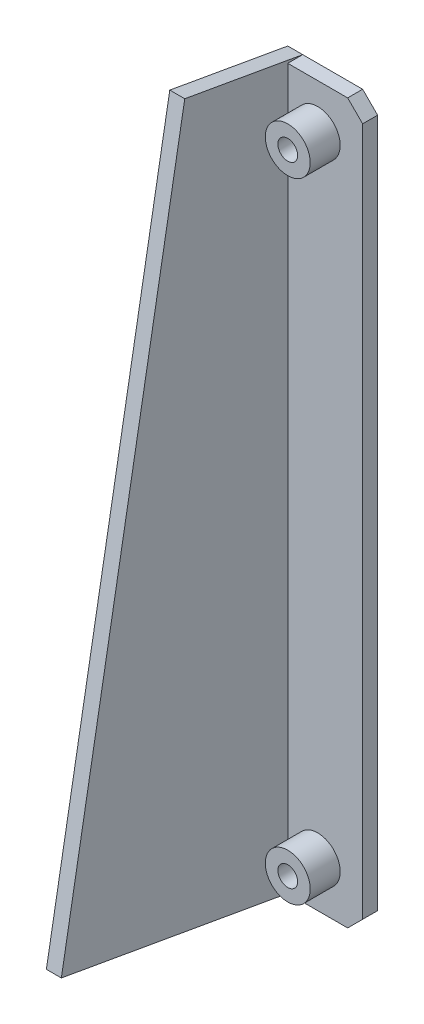
ISO-10303-21;
HEADER;
FILE_DESCRIPTION(('STEP AP214'),'2;1');
FILE_NAME('part.step','',(''),(''),'','','');
FILE_SCHEMA(('AUTOMOTIVE_DESIGN { 1 0 10303 214 1 1 1 1 }'));
ENDSEC;
DATA;
#1=APPLICATION_CONTEXT('core data for automotive mechanical design processes');
#2=APPLICATION_PROTOCOL_DEFINITION('international standard','automotive_design',2000,#1);
#3=PRODUCT_CONTEXT('',#1,'mechanical');
#4=PRODUCT('Part','Part','',(#3));
#5=PRODUCT_RELATED_PRODUCT_CATEGORY('part','',(#4));
#6=PRODUCT_DEFINITION_FORMATION('','',#4);
#7=PRODUCT_DEFINITION_CONTEXT('part definition',#1,'design');
#8=PRODUCT_DEFINITION('design','',#6,#7);
#9=PRODUCT_DEFINITION_SHAPE('','',#8);
#10=(LENGTH_UNIT() NAMED_UNIT(*) SI_UNIT(.MILLI.,.METRE.));
#11=(NAMED_UNIT(*) PLANE_ANGLE_UNIT() SI_UNIT($,.RADIAN.));
#12=(NAMED_UNIT(*) SI_UNIT($,.STERADIAN.) SOLID_ANGLE_UNIT());
#13=UNCERTAINTY_MEASURE_WITH_UNIT(LENGTH_MEASURE(1.E-05),#10,'distance_accuracy_value','');
#14=(GEOMETRIC_REPRESENTATION_CONTEXT(3) GLOBAL_UNCERTAINTY_ASSIGNED_CONTEXT((#13)) GLOBAL_UNIT_ASSIGNED_CONTEXT((#10,
#11,#12)) REPRESENTATION_CONTEXT('',''));
#15=CARTESIAN_POINT('',(0.,0.,0.));
#16=DIRECTION('',(0.,0.,1.));
#17=DIRECTION('',(1.,0.,0.));
#18=AXIS2_PLACEMENT_3D('',#15,#16,#17);
#19=CARTESIAN_POINT('',(0.,0.,1.5875));
#20=DIRECTION('',(0.,0.,1.));
#21=DIRECTION('',(1.,0.,0.));
#22=AXIS2_PLACEMENT_3D('',#19,#20,#21);
#23=PLANE('',#22);
#24=DIRECTION('',(0.,1.,0.));
#25=VECTOR('',#24,1.);
#26=CARTESIAN_POINT('',(-7.93749999999984,0.,1.5875));
#27=LINE('',#26,#25);
#28=CARTESIAN_POINT('',(-7.93749999999984,0.,1.58750000000002));
#29=VERTEX_POINT('',#28);
#30=CARTESIAN_POINT('',(-7.93749999999999,76.2,1.5875));
#31=VERTEX_POINT('',#30);
#32=EDGE_CURVE('E194',#29,#31,#27,.T.);
#33=ORIENTED_EDGE('',*,*,#32,.F.);
#34=DIRECTION('',(1.,0.,0.));
#35=VECTOR('',#34,1.);
#36=CARTESIAN_POINT('',(0.,0.,1.5875));
#37=LINE('',#36,#35);
#38=CARTESIAN_POINT('',(-1.58750000000001,0.,1.5875));
#39=VERTEX_POINT('',#38);
#40=EDGE_CURVE('E140',#29,#39,#37,.T.);
#41=ORIENTED_EDGE('',*,*,#40,.T.);
#42=DIRECTION('',(-0.707106781186551,-0.707106781186544,0.));
#43=VECTOR('',#42,1.);
#44=CARTESIAN_POINT('',(-0.793749999999999,0.793750000000006,1.5875));
#45=LINE('',#44,#43);
#46=CARTESIAN_POINT('',(0.,1.5875,1.5875));
#47=VERTEX_POINT('',#46);
#48=EDGE_CURVE('E150',#39,#47,#45,.F.);
#49=ORIENTED_EDGE('',*,*,#48,.T.);
#50=DIRECTION('',(0.,1.,0.));
#51=VECTOR('',#50,1.);
#52=CARTESIAN_POINT('',(0.,0.,1.5875));
#53=LINE('',#52,#51);
#54=CARTESIAN_POINT('',(0.,74.6125,1.5875));
#55=VERTEX_POINT('',#54);
#56=EDGE_CURVE('E116',#47,#55,#53,.T.);
#57=ORIENTED_EDGE('',*,*,#56,.T.);
#58=DIRECTION('',(0.707106781186548,-0.707106781186548,0.));
#59=VECTOR('',#58,1.);
#60=CARTESIAN_POINT('',(37.30625,37.30625,1.5875));
#61=LINE('',#60,#59);
#62=CARTESIAN_POINT('',(-1.5875,76.2,1.5875));
#63=VERTEX_POINT('',#62);
#64=EDGE_CURVE('E44',#55,#63,#61,.F.);
#65=ORIENTED_EDGE('',*,*,#64,.T.);
#66=DIRECTION('',(-1.,0.,0.));
#67=VECTOR('',#66,1.);
#68=CARTESIAN_POINT('',(0.,76.2,1.5875));
#69=LINE('',#68,#67);
#70=EDGE_CURVE('E157',#63,#31,#69,.T.);
#71=ORIENTED_EDGE('',*,*,#70,.T.);
#72=EDGE_LOOP('',(#33,#41,#49,#57,#65,#71));
#73=FACE_BOUND('',#72,.T.);
#74=CARTESIAN_POINT('',(-4.7625,4.7625,1.5875));
#75=DIRECTION('',(0.,0.,1.));
#76=DIRECTION('',(1.,0.,0.));
#77=AXIS2_PLACEMENT_3D('',#74,#75,#76);
#78=CIRCLE('',#77,2.38125);
#79=CARTESIAN_POINT('',(-2.38125,4.7625,1.5875));
#80=VERTEX_POINT('',#79);
#81=EDGE_CURVE('E177',#80,#80,#78,.T.);
#82=ORIENTED_EDGE('',*,*,#81,.F.);
#83=EDGE_LOOP('',(#82));
#84=FACE_BOUND('',#83,.T.);
#85=CARTESIAN_POINT('',(-4.7625,71.4375,1.5875));
#86=DIRECTION('',(0.,0.,1.));
#87=DIRECTION('',(-1.,0.,0.));
#88=AXIS2_PLACEMENT_3D('',#85,#86,#87);
#89=CIRCLE('',#88,2.38125);
#90=CARTESIAN_POINT('',(-7.14375,71.4375,1.5875));
#91=VERTEX_POINT('',#90);
#92=EDGE_CURVE('E186',#91,#91,#89,.T.);
#93=ORIENTED_EDGE('',*,*,#92,.F.);
#94=EDGE_LOOP('',(#93));
#95=FACE_BOUND('',#94,.T.);
#96=ADVANCED_FACE('F35',(#73,#84,#95),#23,.T.);
#97=CARTESIAN_POINT('',(0.,0.,1.5875));
#98=DIRECTION('',(-1.,0.,0.));
#99=DIRECTION('',(0.,0.,1.));
#100=AXIS2_PLACEMENT_3D('',#97,#98,#99);
#101=PLANE('',#100);
#102=DIRECTION('',(0.,1.,0.));
#103=VECTOR('',#102,1.);
#104=CARTESIAN_POINT('',(0.,0.,0.));
#105=LINE('',#104,#103);
#106=CARTESIAN_POINT('',(0.,1.5875,0.));
#107=VERTEX_POINT('',#106);
#108=CARTESIAN_POINT('',(0.,74.6125,0.));
#109=VERTEX_POINT('',#108);
#110=EDGE_CURVE('E132',#107,#109,#105,.T.);
#111=ORIENTED_EDGE('',*,*,#110,.T.);
#112=DIRECTION('',(0.,0.,1.));
#113=VECTOR('',#112,1.);
#114=CARTESIAN_POINT('',(0.,74.6125,1.5875));
#115=LINE('',#114,#113);
#116=EDGE_CURVE('E57',#109,#55,#115,.T.);
#117=ORIENTED_EDGE('',*,*,#116,.T.);
#118=ORIENTED_EDGE('',*,*,#56,.F.);
#119=DIRECTION('',(0.,0.,-1.));
#120=VECTOR('',#119,1.);
#121=CARTESIAN_POINT('',(0.,1.5875,1.5875));
#122=LINE('',#121,#120);
#123=EDGE_CURVE('E146',#47,#107,#122,.T.);
#124=ORIENTED_EDGE('',*,*,#123,.T.);
#125=EDGE_LOOP('',(#111,#117,#118,#124));
#126=FACE_BOUND('',#125,.T.);
#127=ADVANCED_FACE('F165',(#126),#101,.F.);
#128=CARTESIAN_POINT('',(0.,76.2,1.5875));
#129=DIRECTION('',(0.,-1.,0.));
#130=DIRECTION('',(1.,0.,0.));
#131=AXIS2_PLACEMENT_3D('',#128,#129,#130);
#132=PLANE('',#131);
#133=ORIENTED_EDGE('',*,*,#70,.F.);
#134=DIRECTION('',(0.,0.,-1.));
#135=VECTOR('',#134,1.);
#136=CARTESIAN_POINT('',(-1.5875,76.2,1.5875));
#137=LINE('',#136,#135);
#138=CARTESIAN_POINT('',(-1.5875,76.2,0.));
#139=VERTEX_POINT('',#138);
#140=EDGE_CURVE('E139',#63,#139,#137,.T.);
#141=ORIENTED_EDGE('',*,*,#140,.T.);
#142=DIRECTION('',(-1.,0.,0.));
#143=VECTOR('',#142,1.);
#144=CARTESIAN_POINT('',(0.,76.2,0.));
#145=LINE('',#144,#143);
#146=CARTESIAN_POINT('',(-7.93749999999984,76.2,0.));
#147=VERTEX_POINT('',#146);
#148=EDGE_CURVE('E129',#139,#147,#145,.T.);
#149=ORIENTED_EDGE('',*,*,#148,.T.);
#150=DIRECTION('',(0.,0.,1.));
#151=VECTOR('',#150,1.);
#152=CARTESIAN_POINT('',(-7.93749999999999,76.2,1.5875));
#153=LINE('',#152,#151);
#154=EDGE_CURVE('E136',#147,#31,#153,.T.);
#155=ORIENTED_EDGE('',*,*,#154,.T.);
#156=EDGE_LOOP('',(#133,#141,#149,#155));
#157=FACE_BOUND('',#156,.T.);
#158=ADVANCED_FACE('F161',(#157),#132,.F.);
#159=CARTESIAN_POINT('',(-9.52500000000001,0.,1.5875));
#160=DIRECTION('',(1.,0.,0.));
#161=DIRECTION('',(0.,1.,0.));
#162=AXIS2_PLACEMENT_3D('',#159,#160,#161);
#163=PLANE('',#162);
#164=DIRECTION('',(0.,-1.,0.));
#165=VECTOR('',#164,1.);
#166=CARTESIAN_POINT('',(-9.52500000000001,0.,0.));
#167=LINE('',#166,#165);
#168=CARTESIAN_POINT('',(-9.525,76.2,0.));
#169=VERTEX_POINT('',#168);
#170=CARTESIAN_POINT('',(-9.52500000000001,0.,0.));
#171=VERTEX_POINT('',#170);
#172=EDGE_CURVE('E112',#169,#171,#167,.T.);
#173=ORIENTED_EDGE('',*,*,#172,.T.);
#174=DIRECTION('',(0.,0.,1.));
#175=VECTOR('',#174,1.);
#176=CARTESIAN_POINT('',(-9.52500000000001,0.,0.));
#177=LINE('',#176,#175);
#178=CARTESIAN_POINT('',(-9.52500000000001,0.,1.58750000000002));
#179=VERTEX_POINT('',#178);
#180=EDGE_CURVE('E119',#171,#179,#177,.T.);
#181=ORIENTED_EDGE('',*,*,#180,.T.);
#182=DIRECTION('',(0.,-0.173648177666931,-0.984807753012208));
#183=VECTOR('',#182,1.);
#184=CARTESIAN_POINT('',(-9.52499999999985,4.23156451566216,25.5858949062142));
#185=LINE('',#184,#183);
#186=CARTESIAN_POINT('',(-9.52499999999985,4.23156451566216,25.5858949062142));
#187=VERTEX_POINT('',#186);
#188=EDGE_CURVE('E196',#187,#179,#185,.T.);
#189=ORIENTED_EDGE('',*,*,#188,.F.);
#190=DIRECTION('',(0.,0.984807753012208,-0.173648177666931));
#191=VECTOR('',#190,1.);
#192=CARTESIAN_POINT('',(-9.52500000000001,78.40533185637,12.507058463255));
#193=LINE('',#192,#191);
#194=CARTESIAN_POINT('',(-9.52500000000001,78.40533185637,12.507058463255));
#195=VERTEX_POINT('',#194);
#196=EDGE_CURVE('E208',#187,#195,#193,.T.);
#197=ORIENTED_EDGE('',*,*,#196,.T.);
#198=DIRECTION('',(0.,-0.173648177666931,-0.984807753012208));
#199=VECTOR('',#198,1.);
#200=CARTESIAN_POINT('',(-9.52500000000001,78.40533185637,12.507058463255));
#201=LINE('',#200,#199);
#202=EDGE_CURVE('E127',#195,#169,#201,.T.);
#203=ORIENTED_EDGE('',*,*,#202,.T.);
#204=EDGE_LOOP('',(#173,#181,#189,#197,#203));
#205=FACE_BOUND('',#204,.T.);
#206=ADVANCED_FACE('F125',(#205),#163,.F.);
#207=CARTESIAN_POINT('',(0.,0.,1.5875));
#208=DIRECTION('',(0.,1.,0.));
#209=DIRECTION('',(-1.,0.,0.));
#210=AXIS2_PLACEMENT_3D('',#207,#208,#209);
#211=PLANE('',#210);
#212=DIRECTION('',(1.,0.,0.));
#213=VECTOR('',#212,1.);
#214=CARTESIAN_POINT('',(0.,0.,0.));
#215=LINE('',#214,#213);
#216=CARTESIAN_POINT('',(-1.58750000000001,0.,0.));
#217=VERTEX_POINT('',#216);
#218=EDGE_CURVE('E107',#171,#217,#215,.T.);
#219=ORIENTED_EDGE('',*,*,#218,.T.);
#220=DIRECTION('',(0.,0.,1.));
#221=VECTOR('',#220,1.);
#222=CARTESIAN_POINT('',(-1.58750000000001,0.,1.5875));
#223=LINE('',#222,#221);
#224=EDGE_CURVE('E11',#217,#39,#223,.T.);
#225=ORIENTED_EDGE('',*,*,#224,.T.);
#226=ORIENTED_EDGE('',*,*,#40,.F.);
#227=DIRECTION('',(1.,0.,0.));
#228=VECTOR('',#227,1.);
#229=CARTESIAN_POINT('',(-9.52500000000001,0.,1.58750000000002));
#230=LINE('',#229,#228);
#231=EDGE_CURVE('E121',#179,#29,#230,.T.);
#232=ORIENTED_EDGE('',*,*,#231,.F.);
#233=ORIENTED_EDGE('',*,*,#180,.F.);
#234=EDGE_LOOP('',(#219,#225,#226,#232,#233));
#235=FACE_BOUND('',#234,.T.);
#236=ADVANCED_FACE('F120',(#235),#211,.F.);
#237=CARTESIAN_POINT('',(0.,0.,0.));
#238=DIRECTION('',(0.,0.,1.));
#239=DIRECTION('',(1.,0.,0.));
#240=AXIS2_PLACEMENT_3D('',#237,#238,#239);
#241=PLANE('',#240);
#242=CARTESIAN_POINT('',(-4.7625,4.7625,0.));
#243=DIRECTION('',(0.,0.,1.));
#244=DIRECTION('',(1.,0.,0.));
#245=AXIS2_PLACEMENT_3D('',#242,#243,#244);
#246=CIRCLE('',#245,1.04775);
#247=CARTESIAN_POINT('',(-3.71475,4.7625,0.));
#248=VERTEX_POINT('',#247);
#249=EDGE_CURVE('E169',#248,#248,#246,.T.);
#250=ORIENTED_EDGE('',*,*,#249,.T.);
#251=EDGE_LOOP('',(#250));
#252=FACE_BOUND('',#251,.T.);
#253=CARTESIAN_POINT('',(-4.7625,71.4375,0.));
#254=DIRECTION('',(0.,0.,1.));
#255=DIRECTION('',(1.,0.,0.));
#256=AXIS2_PLACEMENT_3D('',#253,#254,#255);
#257=CIRCLE('',#256,1.04775);
#258=CARTESIAN_POINT('',(-3.71475,71.4375,0.));
#259=VERTEX_POINT('',#258);
#260=EDGE_CURVE('E167',#259,#259,#257,.T.);
#261=ORIENTED_EDGE('',*,*,#260,.T.);
#262=EDGE_LOOP('',(#261));
#263=FACE_BOUND('',#262,.T.);
#264=ORIENTED_EDGE('',*,*,#218,.F.);
#265=ORIENTED_EDGE('',*,*,#172,.F.);
#266=DIRECTION('',(1.,0.,0.));
#267=VECTOR('',#266,1.);
#268=CARTESIAN_POINT('',(-9.525,76.2,0.));
#269=LINE('',#268,#267);
#270=EDGE_CURVE('E206',#169,#147,#269,.T.);
#271=ORIENTED_EDGE('',*,*,#270,.T.);
#272=ORIENTED_EDGE('',*,*,#148,.F.);
#273=DIRECTION('',(-0.707106781186548,0.707106781186548,0.));
#274=VECTOR('',#273,1.);
#275=CARTESIAN_POINT('',(-1.58750000000001,76.2,0.));
#276=LINE('',#275,#274);
#277=EDGE_CURVE('E144',#139,#109,#276,.F.);
#278=ORIENTED_EDGE('',*,*,#277,.T.);
#279=ORIENTED_EDGE('',*,*,#110,.F.);
#280=DIRECTION('',(0.707106781186551,0.707106781186544,0.));
#281=VECTOR('',#280,1.);
#282=CARTESIAN_POINT('',(0.,1.5875,0.));
#283=LINE('',#282,#281);
#284=EDGE_CURVE('E115',#107,#217,#283,.F.);
#285=ORIENTED_EDGE('',*,*,#284,.T.);
#286=EDGE_LOOP('',(#264,#265,#271,#272,#278,#279,#285));
#287=FACE_BOUND('',#286,.T.);
#288=ADVANCED_FACE('F109',(#252,#263,#287),#241,.F.);
#289=CARTESIAN_POINT('',(-1.58750000000001,76.2,1.5875));
#290=DIRECTION('',(-0.707106781186548,-0.707106781186548,0.));
#291=DIRECTION('',(0.,0.,-1.));
#292=AXIS2_PLACEMENT_3D('',#289,#290,#291);
#293=PLANE('',#292);
#294=ORIENTED_EDGE('',*,*,#64,.F.);
#295=ORIENTED_EDGE('',*,*,#116,.F.);
#296=ORIENTED_EDGE('',*,*,#277,.F.);
#297=ORIENTED_EDGE('',*,*,#140,.F.);
#298=EDGE_LOOP('',(#294,#295,#296,#297));
#299=FACE_BOUND('',#298,.T.);
#300=ADVANCED_FACE('F164',(#299),#293,.F.);
#301=CARTESIAN_POINT('',(0.,1.5875,1.5875));
#302=DIRECTION('',(-0.707106781186544,0.707106781186551,0.));
#303=DIRECTION('',(0.,0.,-1.));
#304=AXIS2_PLACEMENT_3D('',#301,#302,#303);
#305=PLANE('',#304);
#306=ORIENTED_EDGE('',*,*,#48,.F.);
#307=ORIENTED_EDGE('',*,*,#224,.F.);
#308=ORIENTED_EDGE('',*,*,#284,.F.);
#309=ORIENTED_EDGE('',*,*,#123,.F.);
#310=EDGE_LOOP('',(#306,#307,#308,#309));
#311=FACE_BOUND('',#310,.T.);
#312=ADVANCED_FACE('F38',(#311),#305,.F.);
#313=CARTESIAN_POINT('',(-4.7625,71.4375,1.5875));
#314=DIRECTION('',(0.,0.,1.));
#315=DIRECTION('',(1.,0.,0.));
#316=AXIS2_PLACEMENT_3D('',#313,#314,#315);
#317=CYLINDRICAL_SURFACE('',#316,1.04775);
#318=ORIENTED_EDGE('',*,*,#260,.F.);
#319=EDGE_LOOP('',(#318));
#320=FACE_BOUND('',#319,.T.);
#321=CARTESIAN_POINT('',(-4.7625,71.4375,4.7625));
#322=DIRECTION('',(0.,0.,1.));
#323=DIRECTION('',(-1.,0.,0.));
#324=AXIS2_PLACEMENT_3D('',#321,#322,#323);
#325=CIRCLE('',#324,1.04775);
#326=CARTESIAN_POINT('',(-5.81025,71.4375,4.7625));
#327=VERTEX_POINT('',#326);
#328=EDGE_CURVE('E189',#327,#327,#325,.T.);
#329=ORIENTED_EDGE('',*,*,#328,.T.);
#330=EDGE_LOOP('',(#329));
#331=FACE_BOUND('',#330,.T.);
#332=ADVANCED_FACE('F227',(#320,#331),#317,.F.);
#333=CARTESIAN_POINT('',(-4.7625,4.7625,1.5875));
#334=DIRECTION('',(0.,0.,1.));
#335=DIRECTION('',(1.,0.,0.));
#336=AXIS2_PLACEMENT_3D('',#333,#334,#335);
#337=CYLINDRICAL_SURFACE('',#336,1.04775);
#338=ORIENTED_EDGE('',*,*,#249,.F.);
#339=EDGE_LOOP('',(#338));
#340=FACE_BOUND('',#339,.T.);
#341=CARTESIAN_POINT('',(-4.7625,4.7625,4.7625));
#342=DIRECTION('',(0.,0.,1.));
#343=DIRECTION('',(1.,0.,0.));
#344=AXIS2_PLACEMENT_3D('',#341,#342,#343);
#345=CIRCLE('',#344,1.04775);
#346=CARTESIAN_POINT('',(-3.71475,4.7625,4.7625));
#347=VERTEX_POINT('',#346);
#348=EDGE_CURVE('E180',#347,#347,#345,.T.);
#349=ORIENTED_EDGE('',*,*,#348,.T.);
#350=EDGE_LOOP('',(#349));
#351=FACE_BOUND('',#350,.T.);
#352=ADVANCED_FACE('F232',(#340,#351),#337,.F.);
#353=CARTESIAN_POINT('',(-4.7625,4.7625,4.7625));
#354=DIRECTION('',(0.,0.,1.));
#355=DIRECTION('',(1.,0.,0.));
#356=AXIS2_PLACEMENT_3D('',#353,#354,#355);
#357=PLANE('',#356);
#358=CARTESIAN_POINT('',(-4.7625,4.7625,4.7625));
#359=DIRECTION('',(0.,0.,1.));
#360=DIRECTION('',(1.,0.,0.));
#361=AXIS2_PLACEMENT_3D('',#358,#359,#360);
#362=CIRCLE('',#361,2.38125);
#363=CARTESIAN_POINT('',(-2.38125,4.7625,4.7625));
#364=VERTEX_POINT('',#363);
#365=EDGE_CURVE('E176',#364,#364,#362,.T.);
#366=ORIENTED_EDGE('',*,*,#365,.T.);
#367=EDGE_LOOP('',(#366));
#368=FACE_BOUND('',#367,.T.);
#369=ORIENTED_EDGE('',*,*,#348,.F.);
#370=EDGE_LOOP('',(#369));
#371=FACE_BOUND('',#370,.T.);
#372=ADVANCED_FACE('F303',(#368,#371),#357,.T.);
#373=CARTESIAN_POINT('',(-4.7625,4.7625,4.7625));
#374=DIRECTION('',(0.,0.,-1.));
#375=DIRECTION('',(-1.,0.,0.));
#376=AXIS2_PLACEMENT_3D('',#373,#374,#375);
#377=CYLINDRICAL_SURFACE('',#376,2.38125);
#378=ORIENTED_EDGE('',*,*,#365,.F.);
#379=EDGE_LOOP('',(#378));
#380=FACE_BOUND('',#379,.T.);
#381=ORIENTED_EDGE('',*,*,#81,.T.);
#382=EDGE_LOOP('',(#381));
#383=FACE_BOUND('',#382,.T.);
#384=ADVANCED_FACE('F313',(#380,#383),#377,.T.);
#385=CARTESIAN_POINT('',(-4.7625,71.4375,4.7625));
#386=DIRECTION('',(0.,0.,-1.));
#387=DIRECTION('',(-1.,0.,0.));
#388=AXIS2_PLACEMENT_3D('',#385,#386,#387);
#389=PLANE('',#388);
#390=CARTESIAN_POINT('',(-4.7625,71.4375,4.7625));
#391=DIRECTION('',(0.,0.,1.));
#392=DIRECTION('',(-1.,0.,0.));
#393=AXIS2_PLACEMENT_3D('',#390,#391,#392);
#394=CIRCLE('',#393,2.38125);
#395=CARTESIAN_POINT('',(-7.14375,71.4375,4.7625));
#396=VERTEX_POINT('',#395);
#397=EDGE_CURVE('E185',#396,#396,#394,.T.);
#398=ORIENTED_EDGE('',*,*,#397,.T.);
#399=EDGE_LOOP('',(#398));
#400=FACE_BOUND('',#399,.T.);
#401=ORIENTED_EDGE('',*,*,#328,.F.);
#402=EDGE_LOOP('',(#401));
#403=FACE_BOUND('',#402,.T.);
#404=ADVANCED_FACE('F323',(#400,#403),#389,.F.);
#405=CARTESIAN_POINT('',(-4.7625,71.4375,4.7625));
#406=DIRECTION('',(0.,0.,-1.));
#407=DIRECTION('',(-1.,0.,0.));
#408=AXIS2_PLACEMENT_3D('',#405,#406,#407);
#409=CYLINDRICAL_SURFACE('',#408,2.38125);
#410=ORIENTED_EDGE('',*,*,#397,.F.);
#411=EDGE_LOOP('',(#410));
#412=FACE_BOUND('',#411,.T.);
#413=ORIENTED_EDGE('',*,*,#92,.T.);
#414=EDGE_LOOP('',(#413));
#415=FACE_BOUND('',#414,.T.);
#416=ADVANCED_FACE('F332',(#412,#415),#409,.T.);
#417=CARTESIAN_POINT('',(-7.93749999999999,78.40533185637,12.507058463255));
#418=DIRECTION('',(1.,0.,0.));
#419=DIRECTION('',(0.,1.,0.));
#420=AXIS2_PLACEMENT_3D('',#417,#418,#419);
#421=PLANE('',#420);
#422=ORIENTED_EDGE('',*,*,#32,.T.);
#423=ORIENTED_EDGE('',*,*,#154,.F.);
#424=DIRECTION('',(0.,-0.173648177666931,-0.984807753012208));
#425=VECTOR('',#424,1.);
#426=CARTESIAN_POINT('',(-7.93749999999999,78.40533185637,12.507058463255));
#427=LINE('',#426,#425);
#428=CARTESIAN_POINT('',(-7.93749999999999,78.40533185637,12.507058463255));
#429=VERTEX_POINT('',#428);
#430=EDGE_CURVE('E198',#429,#147,#427,.T.);
#431=ORIENTED_EDGE('',*,*,#430,.F.);
#432=DIRECTION('',(0.,-0.984807753012208,0.173648177666931));
#433=VECTOR('',#432,1.);
#434=CARTESIAN_POINT('',(-7.93749999999999,78.40533185637,12.507058463255));
#435=LINE('',#434,#433);
#436=CARTESIAN_POINT('',(-7.93749999999985,4.23156451566217,25.5858949062142));
#437=VERTEX_POINT('',#436);
#438=EDGE_CURVE('E211',#429,#437,#435,.T.);
#439=ORIENTED_EDGE('',*,*,#438,.T.);
#440=DIRECTION('',(0.,-0.173648177666931,-0.984807753012208));
#441=VECTOR('',#440,1.);
#442=CARTESIAN_POINT('',(-7.93749999999985,4.23156451566217,25.5858949062142));
#443=LINE('',#442,#441);
#444=EDGE_CURVE('E202',#437,#29,#443,.T.);
#445=ORIENTED_EDGE('',*,*,#444,.T.);
#446=EDGE_LOOP('',(#422,#423,#431,#439,#445));
#447=FACE_BOUND('',#446,.T.);
#448=ADVANCED_FACE('F221',(#447),#421,.T.);
#449=CARTESIAN_POINT('',(-9.52499999999985,4.23156451566216,25.5858949062142));
#450=DIRECTION('',(0.,-0.984807753012208,0.173648177666931));
#451=DIRECTION('',(0.,-0.173648177666931,-0.984807753012208));
#452=AXIS2_PLACEMENT_3D('',#449,#450,#451);
#453=PLANE('',#452);
#454=ORIENTED_EDGE('',*,*,#231,.T.);
#455=ORIENTED_EDGE('',*,*,#444,.F.);
#456=DIRECTION('',(-1.,0.,0.));
#457=VECTOR('',#456,1.);
#458=CARTESIAN_POINT('',(-9.52499999999985,4.23156451566216,25.5858949062142));
#459=LINE('',#458,#457);
#460=EDGE_CURVE('E199',#437,#187,#459,.T.);
#461=ORIENTED_EDGE('',*,*,#460,.T.);
#462=ORIENTED_EDGE('',*,*,#188,.T.);
#463=EDGE_LOOP('',(#454,#455,#461,#462));
#464=FACE_BOUND('',#463,.T.);
#465=ADVANCED_FACE('F219',(#464),#453,.T.);
#466=CARTESIAN_POINT('',(-9.52500000000001,78.40533185637,12.507058463255));
#467=DIRECTION('',(0.,0.984807753012208,-0.173648177666931));
#468=DIRECTION('',(0.,0.173648177666931,0.984807753012208));
#469=AXIS2_PLACEMENT_3D('',#466,#467,#468);
#470=PLANE('',#469);
#471=ORIENTED_EDGE('',*,*,#270,.F.);
#472=ORIENTED_EDGE('',*,*,#202,.F.);
#473=DIRECTION('',(1.,0.,0.));
#474=VECTOR('',#473,1.);
#475=CARTESIAN_POINT('',(-9.52500000000001,78.40533185637,12.507058463255));
#476=LINE('',#475,#474);
#477=EDGE_CURVE('E214',#195,#429,#476,.T.);
#478=ORIENTED_EDGE('',*,*,#477,.T.);
#479=ORIENTED_EDGE('',*,*,#430,.T.);
#480=EDGE_LOOP('',(#471,#472,#478,#479));
#481=FACE_BOUND('',#480,.T.);
#482=ADVANCED_FACE('F355',(#481),#470,.T.);
#483=CARTESIAN_POINT('',(0.,4.50304300442692,25.5380259239631));
#484=DIRECTION('',(0.,0.173648177666931,0.984807753012208));
#485=DIRECTION('',(0.,-0.984807753012208,0.173648177666931));
#486=AXIS2_PLACEMENT_3D('',#483,#484,#485);
#487=PLANE('',#486);
#488=ORIENTED_EDGE('',*,*,#196,.F.);
#489=ORIENTED_EDGE('',*,*,#460,.F.);
#490=ORIENTED_EDGE('',*,*,#438,.F.);
#491=ORIENTED_EDGE('',*,*,#477,.F.);
#492=EDGE_LOOP('',(#488,#489,#490,#491));
#493=FACE_BOUND('',#492,.T.);
#494=ADVANCED_FACE('F361',(#493),#487,.T.);
#495=CLOSED_SHELL('',(#96,#127,#158,#206,#236,#288,#300,#312,#332,#352,#372,#384,#404,#416,#448,
#465,#482,#494));
#496=MANIFOLD_SOLID_BREP('B2',#495);
#497=ADVANCED_BREP_SHAPE_REPRESENTATION('',(#18,#496),#14);
#498=SHAPE_DEFINITION_REPRESENTATION(#9,#497);
ENDSEC;
END-ISO-10303-21;
